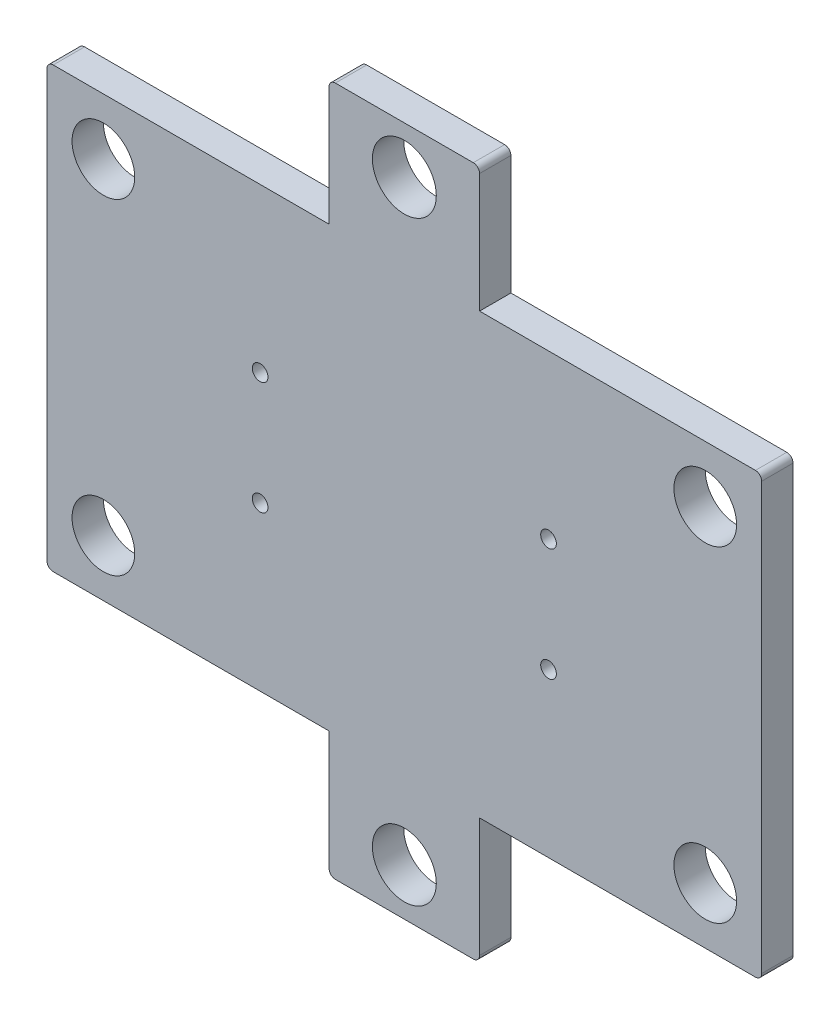
ISO-10303-21;
HEADER;
FILE_DESCRIPTION(('STEP AP214'),'2;1');
FILE_NAME('part.step','',(''),(''),'','','');
FILE_SCHEMA(('AUTOMOTIVE_DESIGN { 1 0 10303 214 1 1 1 1 }'));
ENDSEC;
DATA;
#1=APPLICATION_CONTEXT('core data for automotive mechanical design processes');
#2=APPLICATION_PROTOCOL_DEFINITION('international standard','automotive_design',2000,#1);
#3=PRODUCT_CONTEXT('',#1,'mechanical');
#4=PRODUCT('Part','Part','',(#3));
#5=PRODUCT_RELATED_PRODUCT_CATEGORY('part','',(#4));
#6=PRODUCT_DEFINITION_FORMATION('','',#4);
#7=PRODUCT_DEFINITION_CONTEXT('part definition',#1,'design');
#8=PRODUCT_DEFINITION('design','',#6,#7);
#9=PRODUCT_DEFINITION_SHAPE('','',#8);
#10=(LENGTH_UNIT() NAMED_UNIT(*) SI_UNIT(.MILLI.,.METRE.));
#11=(NAMED_UNIT(*) PLANE_ANGLE_UNIT() SI_UNIT($,.RADIAN.));
#12=(NAMED_UNIT(*) SI_UNIT($,.STERADIAN.) SOLID_ANGLE_UNIT());
#13=UNCERTAINTY_MEASURE_WITH_UNIT(LENGTH_MEASURE(1.E-05),#10,'distance_accuracy_value','');
#14=(GEOMETRIC_REPRESENTATION_CONTEXT(3) GLOBAL_UNCERTAINTY_ASSIGNED_CONTEXT((#13)) GLOBAL_UNIT_ASSIGNED_CONTEXT((#10,
#11,#12)) REPRESENTATION_CONTEXT('',''));
#15=CARTESIAN_POINT('',(0.,0.,0.));
#16=DIRECTION('',(0.,0.,1.));
#17=DIRECTION('',(1.,0.,0.));
#18=AXIS2_PLACEMENT_3D('',#15,#16,#17);
#19=CARTESIAN_POINT('',(0.,0.,5.));
#20=DIRECTION('',(0.,0.,1.));
#21=DIRECTION('',(1.,0.,0.));
#22=AXIS2_PLACEMENT_3D('',#19,#20,#21);
#23=PLANE('',#22);
#24=CARTESIAN_POINT('',(0.,-47.5,5.));
#25=DIRECTION('',(0.,0.,1.));
#26=DIRECTION('',(1.,0.,0.));
#27=AXIS2_PLACEMENT_3D('',#24,#25,#26);
#28=CIRCLE('',#27,5.1);
#29=CARTESIAN_POINT('',(5.1,-47.5,5.));
#30=VERTEX_POINT('',#29);
#31=EDGE_CURVE('E440',#30,#30,#28,.T.);
#32=ORIENTED_EDGE('',*,*,#31,.F.);
#33=EDGE_LOOP('',(#32));
#34=FACE_BOUND('',#33,.T.);
#35=CARTESIAN_POINT('',(0.,47.5,5.));
#36=DIRECTION('',(0.,0.,1.));
#37=DIRECTION('',(1.,0.,0.));
#38=AXIS2_PLACEMENT_3D('',#35,#36,#37);
#39=CIRCLE('',#38,5.1);
#40=CARTESIAN_POINT('',(5.1,47.5,5.));
#41=VERTEX_POINT('',#40);
#42=EDGE_CURVE('E434',#41,#41,#39,.T.);
#43=ORIENTED_EDGE('',*,*,#42,.F.);
#44=EDGE_LOOP('',(#43));
#45=FACE_BOUND('',#44,.T.);
#46=CARTESIAN_POINT('',(47.9999999999998,26.,5.));
#47=DIRECTION('',(0.,0.,-1.));
#48=DIRECTION('',(-1.,0.,0.));
#49=AXIS2_PLACEMENT_3D('',#46,#47,#48);
#50=CIRCLE('',#49,5.);
#51=CARTESIAN_POINT('',(42.9999999999998,26.,5.));
#52=VERTEX_POINT('',#51);
#53=EDGE_CURVE('E420',#52,#52,#50,.T.);
#54=ORIENTED_EDGE('',*,*,#53,.T.);
#55=EDGE_LOOP('',(#54));
#56=FACE_BOUND('',#55,.T.);
#57=CARTESIAN_POINT('',(-47.9999999999998,-26.,5.));
#58=DIRECTION('',(0.,0.,1.));
#59=DIRECTION('',(1.,0.,0.));
#60=AXIS2_PLACEMENT_3D('',#57,#58,#59);
#61=CIRCLE('',#60,5.);
#62=CARTESIAN_POINT('',(-42.9999999999998,-26.,5.));
#63=VERTEX_POINT('',#62);
#64=EDGE_CURVE('E414',#63,#63,#61,.T.);
#65=ORIENTED_EDGE('',*,*,#64,.F.);
#66=EDGE_LOOP('',(#65));
#67=FACE_BOUND('',#66,.T.);
#68=CARTESIAN_POINT('',(-47.9999999999998,26.,5.));
#69=DIRECTION('',(0.,0.,1.));
#70=DIRECTION('',(1.,0.,0.));
#71=AXIS2_PLACEMENT_3D('',#68,#69,#70);
#72=CIRCLE('',#71,5.);
#73=CARTESIAN_POINT('',(-42.9999999999998,26.,5.));
#74=VERTEX_POINT('',#73);
#75=EDGE_CURVE('E408',#74,#74,#72,.T.);
#76=ORIENTED_EDGE('',*,*,#75,.F.);
#77=EDGE_LOOP('',(#76));
#78=FACE_BOUND('',#77,.T.);
#79=CARTESIAN_POINT('',(23.,9.00000000000001,5.));
#80=DIRECTION('',(0.,0.,1.));
#81=DIRECTION('',(1.,0.,0.));
#82=AXIS2_PLACEMENT_3D('',#79,#80,#81);
#83=CIRCLE('',#82,1.24999999999999);
#84=CARTESIAN_POINT('',(24.25,9.00000000000001,5.));
#85=VERTEX_POINT('',#84);
#86=EDGE_CURVE('E404',#85,#85,#83,.T.);
#87=ORIENTED_EDGE('',*,*,#86,.F.);
#88=EDGE_LOOP('',(#87));
#89=FACE_BOUND('',#88,.T.);
#90=CARTESIAN_POINT('',(23.,-8.99999999999999,5.));
#91=DIRECTION('',(0.,0.,1.));
#92=DIRECTION('',(1.,0.,0.));
#93=AXIS2_PLACEMENT_3D('',#90,#91,#92);
#94=CIRCLE('',#93,1.24999999999999);
#95=CARTESIAN_POINT('',(24.25,-8.99999999999999,5.));
#96=VERTEX_POINT('',#95);
#97=EDGE_CURVE('E398',#96,#96,#94,.T.);
#98=ORIENTED_EDGE('',*,*,#97,.F.);
#99=EDGE_LOOP('',(#98));
#100=FACE_BOUND('',#99,.T.);
#101=CARTESIAN_POINT('',(-23.,9.00000000000001,5.));
#102=DIRECTION('',(0.,0.,1.));
#103=DIRECTION('',(1.,0.,0.));
#104=AXIS2_PLACEMENT_3D('',#101,#102,#103);
#105=CIRCLE('',#104,1.24999999999999);
#106=CARTESIAN_POINT('',(-21.75,9.00000000000001,5.));
#107=VERTEX_POINT('',#106);
#108=EDGE_CURVE('E392',#107,#107,#105,.T.);
#109=ORIENTED_EDGE('',*,*,#108,.F.);
#110=EDGE_LOOP('',(#109));
#111=FACE_BOUND('',#110,.T.);
#112=CARTESIAN_POINT('',(-23.,-8.99999999999999,5.));
#113=DIRECTION('',(0.,0.,1.));
#114=DIRECTION('',(1.,0.,0.));
#115=AXIS2_PLACEMENT_3D('',#112,#113,#114);
#116=CIRCLE('',#115,1.24999999999999);
#117=CARTESIAN_POINT('',(-21.75,-8.99999999999999,5.));
#118=VERTEX_POINT('',#117);
#119=EDGE_CURVE('E386',#118,#118,#116,.T.);
#120=ORIENTED_EDGE('',*,*,#119,.F.);
#121=EDGE_LOOP('',(#120));
#122=FACE_BOUND('',#121,.T.);
#123=DIRECTION('',(0.,1.,0.));
#124=VECTOR('',#123,1.);
#125=CARTESIAN_POINT('',(12.0000000000002,35.,5.));
#126=LINE('',#125,#124);
#127=CARTESIAN_POINT('',(12.0000000000002,35.,5.));
#128=VERTEX_POINT('',#127);
#129=CARTESIAN_POINT('',(12.0000000000002,54.,5.));
#130=VERTEX_POINT('',#129);
#131=EDGE_CURVE('E215',#128,#130,#126,.T.);
#132=ORIENTED_EDGE('',*,*,#131,.T.);
#133=CARTESIAN_POINT('',(11.0000000000002,54.,5.));
#134=DIRECTION('',(0.,0.,1.));
#135=DIRECTION('',(1.,0.,0.));
#136=AXIS2_PLACEMENT_3D('',#133,#134,#135);
#137=CIRCLE('',#136,1.);
#138=CARTESIAN_POINT('',(11.0000000000002,55.,5.));
#139=VERTEX_POINT('',#138);
#140=EDGE_CURVE('E294',#130,#139,#137,.T.);
#141=ORIENTED_EDGE('',*,*,#140,.T.);
#142=DIRECTION('',(-1.,0.,0.));
#143=VECTOR('',#142,1.);
#144=CARTESIAN_POINT('',(12.0000000000002,55.,5.));
#145=LINE('',#144,#143);
#146=CARTESIAN_POINT('',(-10.9999999999998,55.,5.));
#147=VERTEX_POINT('',#146);
#148=EDGE_CURVE('E217',#139,#147,#145,.T.);
#149=ORIENTED_EDGE('',*,*,#148,.T.);
#150=CARTESIAN_POINT('',(-10.9999999999998,54.,5.));
#151=DIRECTION('',(0.,0.,1.));
#152=DIRECTION('',(1.,0.,0.));
#153=AXIS2_PLACEMENT_3D('',#150,#151,#152);
#154=CIRCLE('',#153,1.);
#155=CARTESIAN_POINT('',(-11.9999999999998,54.,5.));
#156=VERTEX_POINT('',#155);
#157=EDGE_CURVE('E49',#147,#156,#154,.T.);
#158=ORIENTED_EDGE('',*,*,#157,.T.);
#159=DIRECTION('',(0.,-1.,0.));
#160=VECTOR('',#159,1.);
#161=CARTESIAN_POINT('',(-11.9999999999998,55.,5.));
#162=LINE('',#161,#160);
#163=CARTESIAN_POINT('',(-11.9999999999998,35.,5.));
#164=VERTEX_POINT('',#163);
#165=EDGE_CURVE('E219',#156,#164,#162,.T.);
#166=ORIENTED_EDGE('',*,*,#165,.T.);
#167=DIRECTION('',(-1.,0.,0.));
#168=VECTOR('',#167,1.);
#169=CARTESIAN_POINT('',(-11.9999999999998,35.,5.));
#170=LINE('',#169,#168);
#171=CARTESIAN_POINT('',(-55.9999999999998,35.,5.));
#172=VERTEX_POINT('',#171);
#173=EDGE_CURVE('E253',#164,#172,#170,.T.);
#174=ORIENTED_EDGE('',*,*,#173,.T.);
#175=CARTESIAN_POINT('',(-55.9999999999998,34.,5.));
#176=DIRECTION('',(0.,0.,1.));
#177=DIRECTION('',(1.,0.,0.));
#178=AXIS2_PLACEMENT_3D('',#175,#176,#177);
#179=CIRCLE('',#178,1.);
#180=CARTESIAN_POINT('',(-56.9999999999998,34.,5.));
#181=VERTEX_POINT('',#180);
#182=EDGE_CURVE('E287',#172,#181,#179,.T.);
#183=ORIENTED_EDGE('',*,*,#182,.T.);
#184=DIRECTION('',(0.,-1.,0.));
#185=VECTOR('',#184,1.);
#186=CARTESIAN_POINT('',(-56.9999999999998,35.,5.));
#187=LINE('',#186,#185);
#188=CARTESIAN_POINT('',(-56.9999999999998,-34.,5.));
#189=VERTEX_POINT('',#188);
#190=EDGE_CURVE('E184',#181,#189,#187,.T.);
#191=ORIENTED_EDGE('',*,*,#190,.T.);
#192=CARTESIAN_POINT('',(-55.9999999999998,-34.,5.));
#193=DIRECTION('',(0.,0.,1.));
#194=DIRECTION('',(1.,0.,0.));
#195=AXIS2_PLACEMENT_3D('',#192,#193,#194);
#196=CIRCLE('',#195,1.);
#197=CARTESIAN_POINT('',(-55.9999999999998,-35.,5.));
#198=VERTEX_POINT('',#197);
#199=EDGE_CURVE('E180',#189,#198,#196,.T.);
#200=ORIENTED_EDGE('',*,*,#199,.T.);
#201=DIRECTION('',(1.,0.,0.));
#202=VECTOR('',#201,1.);
#203=CARTESIAN_POINT('',(-56.9999999999998,-35.,5.));
#204=LINE('',#203,#202);
#205=CARTESIAN_POINT('',(-11.9999999999998,-35.,5.));
#206=VERTEX_POINT('',#205);
#207=EDGE_CURVE('E171',#198,#206,#204,.T.);
#208=ORIENTED_EDGE('',*,*,#207,.T.);
#209=DIRECTION('',(0.,-1.,0.));
#210=VECTOR('',#209,1.);
#211=CARTESIAN_POINT('',(-11.9999999999998,-35.,5.));
#212=LINE('',#211,#210);
#213=CARTESIAN_POINT('',(-11.9999999999998,-54.,5.));
#214=VERTEX_POINT('',#213);
#215=EDGE_CURVE('E176',#206,#214,#212,.T.);
#216=ORIENTED_EDGE('',*,*,#215,.T.);
#217=CARTESIAN_POINT('',(-10.9999999999998,-54.,5.));
#218=DIRECTION('',(0.,0.,1.));
#219=DIRECTION('',(1.,0.,0.));
#220=AXIS2_PLACEMENT_3D('',#217,#218,#219);
#221=CIRCLE('',#220,1.);
#222=CARTESIAN_POINT('',(-10.9999999999998,-55.,5.));
#223=VERTEX_POINT('',#222);
#224=EDGE_CURVE('E289',#214,#223,#221,.T.);
#225=ORIENTED_EDGE('',*,*,#224,.T.);
#226=DIRECTION('',(1.,0.,0.));
#227=VECTOR('',#226,1.);
#228=CARTESIAN_POINT('',(-11.9999999999998,-55.,5.));
#229=LINE('',#228,#227);
#230=CARTESIAN_POINT('',(11.0000000000002,-55.,5.));
#231=VERTEX_POINT('',#230);
#232=EDGE_CURVE('E200',#223,#231,#229,.T.);
#233=ORIENTED_EDGE('',*,*,#232,.T.);
#234=CARTESIAN_POINT('',(11.0000000000002,-54.,5.));
#235=DIRECTION('',(0.,0.,1.));
#236=DIRECTION('',(1.,0.,0.));
#237=AXIS2_PLACEMENT_3D('',#234,#235,#236);
#238=CIRCLE('',#237,1.);
#239=CARTESIAN_POINT('',(12.0000000000002,-54.,5.));
#240=VERTEX_POINT('',#239);
#241=EDGE_CURVE('E291',#231,#240,#238,.T.);
#242=ORIENTED_EDGE('',*,*,#241,.T.);
#243=DIRECTION('',(0.,1.,0.));
#244=VECTOR('',#243,1.);
#245=CARTESIAN_POINT('',(12.0000000000002,-55.,5.));
#246=LINE('',#245,#244);
#247=CARTESIAN_POINT('',(12.0000000000002,-35.,5.));
#248=VERTEX_POINT('',#247);
#249=EDGE_CURVE('E203',#240,#248,#246,.T.);
#250=ORIENTED_EDGE('',*,*,#249,.T.);
#251=DIRECTION('',(1.,0.,0.));
#252=VECTOR('',#251,1.);
#253=CARTESIAN_POINT('',(12.0000000000002,-35.,5.));
#254=LINE('',#253,#252);
#255=CARTESIAN_POINT('',(56.0000000000002,-35.,5.));
#256=VERTEX_POINT('',#255);
#257=EDGE_CURVE('E208',#248,#256,#254,.T.);
#258=ORIENTED_EDGE('',*,*,#257,.T.);
#259=CARTESIAN_POINT('',(56.0000000000002,-34.,5.));
#260=DIRECTION('',(0.,0.,1.));
#261=DIRECTION('',(1.,0.,0.));
#262=AXIS2_PLACEMENT_3D('',#259,#260,#261);
#263=CIRCLE('',#262,1.);
#264=CARTESIAN_POINT('',(57.0000000000002,-34.,5.));
#265=VERTEX_POINT('',#264);
#266=EDGE_CURVE('E284',#256,#265,#263,.T.);
#267=ORIENTED_EDGE('',*,*,#266,.T.);
#268=DIRECTION('',(0.,1.,0.));
#269=VECTOR('',#268,1.);
#270=CARTESIAN_POINT('',(57.0000000000002,-35.,5.));
#271=LINE('',#270,#269);
#272=CARTESIAN_POINT('',(57.0000000000002,34.,5.));
#273=VERTEX_POINT('',#272);
#274=EDGE_CURVE('E211',#265,#273,#271,.T.);
#275=ORIENTED_EDGE('',*,*,#274,.T.);
#276=CARTESIAN_POINT('',(56.0000000000002,34.,5.));
#277=DIRECTION('',(0.,0.,1.));
#278=DIRECTION('',(1.,0.,0.));
#279=AXIS2_PLACEMENT_3D('',#276,#277,#278);
#280=CIRCLE('',#279,1.);
#281=CARTESIAN_POINT('',(56.0000000000002,35.,5.));
#282=VERTEX_POINT('',#281);
#283=EDGE_CURVE('E56',#273,#282,#280,.T.);
#284=ORIENTED_EDGE('',*,*,#283,.T.);
#285=DIRECTION('',(-1.,0.,0.));
#286=VECTOR('',#285,1.);
#287=CARTESIAN_POINT('',(57.0000000000002,35.,5.));
#288=LINE('',#287,#286);
#289=EDGE_CURVE('E213',#282,#128,#288,.T.);
#290=ORIENTED_EDGE('',*,*,#289,.T.);
#291=EDGE_LOOP('',(#132,#141,#149,#158,#166,#174,#183,#191,#200,#208,#216,#225,#233,#242,#250,
#258,#267,#275,#284,#290));
#292=FACE_BOUND('',#291,.T.);
#293=CARTESIAN_POINT('',(47.9999999999998,-26.,5.));
#294=DIRECTION('',(0.,0.,-1.));
#295=DIRECTION('',(-1.,0.,0.));
#296=AXIS2_PLACEMENT_3D('',#293,#294,#295);
#297=CIRCLE('',#296,5.);
#298=CARTESIAN_POINT('',(42.9999999999998,-26.,5.));
#299=VERTEX_POINT('',#298);
#300=EDGE_CURVE('E426',#299,#299,#297,.T.);
#301=ORIENTED_EDGE('',*,*,#300,.T.);
#302=EDGE_LOOP('',(#301));
#303=FACE_BOUND('',#302,.T.);
#304=ADVANCED_FACE('F34',(#34,#45,#56,#67,#78,#89,#100,#111,#122,#292,#303),#23,.T.);
#305=CARTESIAN_POINT('',(0.,0.,0.));
#306=DIRECTION('',(0.,0.,1.));
#307=DIRECTION('',(1.,0.,0.));
#308=AXIS2_PLACEMENT_3D('',#305,#306,#307);
#309=PLANE('',#308);
#310=CARTESIAN_POINT('',(0.,-47.5,0.));
#311=DIRECTION('',(0.,0.,1.));
#312=DIRECTION('',(1.,0.,0.));
#313=AXIS2_PLACEMENT_3D('',#310,#311,#312);
#314=CIRCLE('',#313,5.1);
#315=CARTESIAN_POINT('',(5.1,-47.5,0.));
#316=VERTEX_POINT('',#315);
#317=EDGE_CURVE('E437',#316,#316,#314,.T.);
#318=ORIENTED_EDGE('',*,*,#317,.T.);
#319=EDGE_LOOP('',(#318));
#320=FACE_BOUND('',#319,.T.);
#321=CARTESIAN_POINT('',(0.,47.5,0.));
#322=DIRECTION('',(0.,0.,1.));
#323=DIRECTION('',(1.,0.,0.));
#324=AXIS2_PLACEMENT_3D('',#321,#322,#323);
#325=CIRCLE('',#324,5.1);
#326=CARTESIAN_POINT('',(5.1,47.5,0.));
#327=VERTEX_POINT('',#326);
#328=EDGE_CURVE('E429',#327,#327,#325,.T.);
#329=ORIENTED_EDGE('',*,*,#328,.T.);
#330=EDGE_LOOP('',(#329));
#331=FACE_BOUND('',#330,.T.);
#332=CARTESIAN_POINT('',(47.9999999999998,26.,0.));
#333=DIRECTION('',(0.,0.,-1.));
#334=DIRECTION('',(-1.,0.,0.));
#335=AXIS2_PLACEMENT_3D('',#332,#333,#334);
#336=CIRCLE('',#335,5.);
#337=CARTESIAN_POINT('',(42.9999999999998,26.,0.));
#338=VERTEX_POINT('',#337);
#339=EDGE_CURVE('E417',#338,#338,#336,.T.);
#340=ORIENTED_EDGE('',*,*,#339,.F.);
#341=EDGE_LOOP('',(#340));
#342=FACE_BOUND('',#341,.T.);
#343=CARTESIAN_POINT('',(-47.9999999999998,-26.,0.));
#344=DIRECTION('',(0.,0.,1.));
#345=DIRECTION('',(1.,0.,0.));
#346=AXIS2_PLACEMENT_3D('',#343,#344,#345);
#347=CIRCLE('',#346,5.);
#348=CARTESIAN_POINT('',(-42.9999999999998,-26.,0.));
#349=VERTEX_POINT('',#348);
#350=EDGE_CURVE('E411',#349,#349,#347,.T.);
#351=ORIENTED_EDGE('',*,*,#350,.T.);
#352=EDGE_LOOP('',(#351));
#353=FACE_BOUND('',#352,.T.);
#354=CARTESIAN_POINT('',(-47.9999999999998,26.,0.));
#355=DIRECTION('',(0.,0.,1.));
#356=DIRECTION('',(1.,0.,0.));
#357=AXIS2_PLACEMENT_3D('',#354,#355,#356);
#358=CIRCLE('',#357,5.);
#359=CARTESIAN_POINT('',(-42.9999999999998,26.,0.));
#360=VERTEX_POINT('',#359);
#361=EDGE_CURVE('E407',#360,#360,#358,.T.);
#362=ORIENTED_EDGE('',*,*,#361,.T.);
#363=EDGE_LOOP('',(#362));
#364=FACE_BOUND('',#363,.T.);
#365=CARTESIAN_POINT('',(23.,9.00000000000001,0.));
#366=DIRECTION('',(0.,0.,1.));
#367=DIRECTION('',(1.,0.,0.));
#368=AXIS2_PLACEMENT_3D('',#365,#366,#367);
#369=CIRCLE('',#368,1.25);
#370=CARTESIAN_POINT('',(24.25,9.00000000000001,0.));
#371=VERTEX_POINT('',#370);
#372=EDGE_CURVE('E401',#371,#371,#369,.T.);
#373=ORIENTED_EDGE('',*,*,#372,.T.);
#374=EDGE_LOOP('',(#373));
#375=FACE_BOUND('',#374,.T.);
#376=CARTESIAN_POINT('',(23.,-8.99999999999999,0.));
#377=DIRECTION('',(0.,0.,1.));
#378=DIRECTION('',(1.,0.,0.));
#379=AXIS2_PLACEMENT_3D('',#376,#377,#378);
#380=CIRCLE('',#379,1.25);
#381=CARTESIAN_POINT('',(24.25,-8.99999999999999,0.));
#382=VERTEX_POINT('',#381);
#383=EDGE_CURVE('E395',#382,#382,#380,.T.);
#384=ORIENTED_EDGE('',*,*,#383,.T.);
#385=EDGE_LOOP('',(#384));
#386=FACE_BOUND('',#385,.T.);
#387=CARTESIAN_POINT('',(-23.,9.00000000000001,0.));
#388=DIRECTION('',(0.,0.,1.));
#389=DIRECTION('',(1.,0.,0.));
#390=AXIS2_PLACEMENT_3D('',#387,#388,#389);
#391=CIRCLE('',#390,1.25);
#392=CARTESIAN_POINT('',(-21.75,9.00000000000001,0.));
#393=VERTEX_POINT('',#392);
#394=EDGE_CURVE('E389',#393,#393,#391,.T.);
#395=ORIENTED_EDGE('',*,*,#394,.T.);
#396=EDGE_LOOP('',(#395));
#397=FACE_BOUND('',#396,.T.);
#398=CARTESIAN_POINT('',(-23.,-8.99999999999999,0.));
#399=DIRECTION('',(0.,0.,1.));
#400=DIRECTION('',(1.,0.,0.));
#401=AXIS2_PLACEMENT_3D('',#398,#399,#400);
#402=CIRCLE('',#401,1.25);
#403=CARTESIAN_POINT('',(-21.75,-8.99999999999999,0.));
#404=VERTEX_POINT('',#403);
#405=EDGE_CURVE('E226',#404,#404,#402,.T.);
#406=ORIENTED_EDGE('',*,*,#405,.T.);
#407=EDGE_LOOP('',(#406));
#408=FACE_BOUND('',#407,.T.);
#409=DIRECTION('',(-1.,0.,0.));
#410=VECTOR('',#409,1.);
#411=CARTESIAN_POINT('',(12.0000000000002,55.,0.));
#412=LINE('',#411,#410);
#413=CARTESIAN_POINT('',(11.0000000000002,55.,0.));
#414=VERTEX_POINT('',#413);
#415=CARTESIAN_POINT('',(-10.9999999999998,55.,0.));
#416=VERTEX_POINT('',#415);
#417=EDGE_CURVE('E248',#414,#416,#412,.T.);
#418=ORIENTED_EDGE('',*,*,#417,.F.);
#419=CARTESIAN_POINT('',(11.0000000000002,54.,0.));
#420=DIRECTION('',(0.,0.,1.));
#421=DIRECTION('',(1.,0.,0.));
#422=AXIS2_PLACEMENT_3D('',#419,#420,#421);
#423=CIRCLE('',#422,1.);
#424=CARTESIAN_POINT('',(12.0000000000002,54.,0.));
#425=VERTEX_POINT('',#424);
#426=EDGE_CURVE('E279',#414,#425,#423,.F.);
#427=ORIENTED_EDGE('',*,*,#426,.T.);
#428=DIRECTION('',(0.,1.,0.));
#429=VECTOR('',#428,1.);
#430=CARTESIAN_POINT('',(12.0000000000002,35.,0.));
#431=LINE('',#430,#429);
#432=CARTESIAN_POINT('',(12.0000000000002,35.,0.));
#433=VERTEX_POINT('',#432);
#434=EDGE_CURVE('E245',#433,#425,#431,.T.);
#435=ORIENTED_EDGE('',*,*,#434,.F.);
#436=DIRECTION('',(-1.,0.,0.));
#437=VECTOR('',#436,1.);
#438=CARTESIAN_POINT('',(57.0000000000002,35.,0.));
#439=LINE('',#438,#437);
#440=CARTESIAN_POINT('',(56.0000000000002,35.,0.));
#441=VERTEX_POINT('',#440);
#442=EDGE_CURVE('E243',#441,#433,#439,.T.);
#443=ORIENTED_EDGE('',*,*,#442,.F.);
#444=CARTESIAN_POINT('',(56.0000000000002,34.,0.));
#445=DIRECTION('',(0.,0.,1.));
#446=DIRECTION('',(1.,0.,0.));
#447=AXIS2_PLACEMENT_3D('',#444,#445,#446);
#448=CIRCLE('',#447,1.);
#449=CARTESIAN_POINT('',(57.0000000000002,34.,0.));
#450=VERTEX_POINT('',#449);
#451=EDGE_CURVE('E265',#441,#450,#448,.F.);
#452=ORIENTED_EDGE('',*,*,#451,.T.);
#453=DIRECTION('',(0.,1.,0.));
#454=VECTOR('',#453,1.);
#455=CARTESIAN_POINT('',(57.0000000000002,-35.,0.));
#456=LINE('',#455,#454);
#457=CARTESIAN_POINT('',(57.0000000000002,-34.,0.));
#458=VERTEX_POINT('',#457);
#459=EDGE_CURVE('E240',#458,#450,#456,.T.);
#460=ORIENTED_EDGE('',*,*,#459,.F.);
#461=CARTESIAN_POINT('',(56.0000000000002,-34.,0.));
#462=DIRECTION('',(0.,0.,1.));
#463=DIRECTION('',(1.,0.,0.));
#464=AXIS2_PLACEMENT_3D('',#461,#462,#463);
#465=CIRCLE('',#464,1.);
#466=CARTESIAN_POINT('',(56.0000000000002,-35.,0.));
#467=VERTEX_POINT('',#466);
#468=EDGE_CURVE('E267',#458,#467,#465,.F.);
#469=ORIENTED_EDGE('',*,*,#468,.T.);
#470=DIRECTION('',(1.,0.,0.));
#471=VECTOR('',#470,1.);
#472=CARTESIAN_POINT('',(12.0000000000002,-35.,0.));
#473=LINE('',#472,#471);
#474=CARTESIAN_POINT('',(12.0000000000002,-35.,0.));
#475=VERTEX_POINT('',#474);
#476=EDGE_CURVE('E237',#475,#467,#473,.T.);
#477=ORIENTED_EDGE('',*,*,#476,.F.);
#478=DIRECTION('',(0.,1.,0.));
#479=VECTOR('',#478,1.);
#480=CARTESIAN_POINT('',(12.0000000000002,-55.,0.));
#481=LINE('',#480,#479);
#482=CARTESIAN_POINT('',(12.0000000000002,-54.,0.));
#483=VERTEX_POINT('',#482);
#484=EDGE_CURVE('E235',#483,#475,#481,.T.);
#485=ORIENTED_EDGE('',*,*,#484,.F.);
#486=CARTESIAN_POINT('',(11.0000000000002,-54.,0.));
#487=DIRECTION('',(0.,0.,1.));
#488=DIRECTION('',(1.,0.,0.));
#489=AXIS2_PLACEMENT_3D('',#486,#487,#488);
#490=CIRCLE('',#489,1.);
#491=CARTESIAN_POINT('',(11.0000000000002,-55.,0.));
#492=VERTEX_POINT('',#491);
#493=EDGE_CURVE('E275',#483,#492,#490,.F.);
#494=ORIENTED_EDGE('',*,*,#493,.T.);
#495=DIRECTION('',(1.,0.,0.));
#496=VECTOR('',#495,1.);
#497=CARTESIAN_POINT('',(-11.9999999999998,-55.,0.));
#498=LINE('',#497,#496);
#499=CARTESIAN_POINT('',(-10.9999999999998,-55.,0.));
#500=VERTEX_POINT('',#499);
#501=EDGE_CURVE('E232',#500,#492,#498,.T.);
#502=ORIENTED_EDGE('',*,*,#501,.F.);
#503=CARTESIAN_POINT('',(-10.9999999999998,-54.,0.));
#504=DIRECTION('',(0.,0.,1.));
#505=DIRECTION('',(1.,0.,0.));
#506=AXIS2_PLACEMENT_3D('',#503,#504,#505);
#507=CIRCLE('',#506,1.);
#508=CARTESIAN_POINT('',(-11.9999999999998,-54.,0.));
#509=VERTEX_POINT('',#508);
#510=EDGE_CURVE('E273',#500,#509,#507,.F.);
#511=ORIENTED_EDGE('',*,*,#510,.T.);
#512=DIRECTION('',(0.,-1.,0.));
#513=VECTOR('',#512,1.);
#514=CARTESIAN_POINT('',(-11.9999999999998,-35.,0.));
#515=LINE('',#514,#513);
#516=CARTESIAN_POINT('',(-11.9999999999998,-35.,0.));
#517=VERTEX_POINT('',#516);
#518=EDGE_CURVE('E230',#517,#509,#515,.T.);
#519=ORIENTED_EDGE('',*,*,#518,.F.);
#520=DIRECTION('',(1.,0.,0.));
#521=VECTOR('',#520,1.);
#522=CARTESIAN_POINT('',(-56.9999999999998,-35.,0.));
#523=LINE('',#522,#521);
#524=CARTESIAN_POINT('',(-55.9999999999998,-35.,0.));
#525=VERTEX_POINT('',#524);
#526=EDGE_CURVE('E190',#525,#517,#523,.T.);
#527=ORIENTED_EDGE('',*,*,#526,.F.);
#528=CARTESIAN_POINT('',(-55.9999999999998,-34.,0.));
#529=DIRECTION('',(0.,0.,1.));
#530=DIRECTION('',(1.,0.,0.));
#531=AXIS2_PLACEMENT_3D('',#528,#529,#530);
#532=CIRCLE('',#531,1.);
#533=CARTESIAN_POINT('',(-56.9999999999998,-34.,0.));
#534=VERTEX_POINT('',#533);
#535=EDGE_CURVE('E269',#525,#534,#532,.F.);
#536=ORIENTED_EDGE('',*,*,#535,.T.);
#537=DIRECTION('',(0.,-1.,0.));
#538=VECTOR('',#537,1.);
#539=CARTESIAN_POINT('',(-56.9999999999998,35.,0.));
#540=LINE('',#539,#538);
#541=CARTESIAN_POINT('',(-56.9999999999998,34.,0.));
#542=VERTEX_POINT('',#541);
#543=EDGE_CURVE('E225',#542,#534,#540,.T.);
#544=ORIENTED_EDGE('',*,*,#543,.F.);
#545=CARTESIAN_POINT('',(-55.9999999999998,34.,0.));
#546=DIRECTION('',(0.,0.,1.));
#547=DIRECTION('',(1.,0.,0.));
#548=AXIS2_PLACEMENT_3D('',#545,#546,#547);
#549=CIRCLE('',#548,1.);
#550=CARTESIAN_POINT('',(-55.9999999999998,35.,0.));
#551=VERTEX_POINT('',#550);
#552=EDGE_CURVE('E271',#542,#551,#549,.F.);
#553=ORIENTED_EDGE('',*,*,#552,.T.);
#554=DIRECTION('',(-1.,0.,0.));
#555=VECTOR('',#554,1.);
#556=CARTESIAN_POINT('',(-11.9999999999998,35.,0.));
#557=LINE('',#556,#555);
#558=CARTESIAN_POINT('',(-11.9999999999998,35.,0.));
#559=VERTEX_POINT('',#558);
#560=EDGE_CURVE('E222',#559,#551,#557,.T.);
#561=ORIENTED_EDGE('',*,*,#560,.F.);
#562=DIRECTION('',(0.,-1.,0.));
#563=VECTOR('',#562,1.);
#564=CARTESIAN_POINT('',(-11.9999999999998,55.,0.));
#565=LINE('',#564,#563);
#566=CARTESIAN_POINT('',(-11.9999999999998,54.,0.));
#567=VERTEX_POINT('',#566);
#568=EDGE_CURVE('E251',#567,#559,#565,.T.);
#569=ORIENTED_EDGE('',*,*,#568,.F.);
#570=CARTESIAN_POINT('',(-10.9999999999998,54.,0.));
#571=DIRECTION('',(0.,0.,1.));
#572=DIRECTION('',(1.,0.,0.));
#573=AXIS2_PLACEMENT_3D('',#570,#571,#572);
#574=CIRCLE('',#573,1.);
#575=EDGE_CURVE('E277',#567,#416,#574,.F.);
#576=ORIENTED_EDGE('',*,*,#575,.T.);
#577=EDGE_LOOP('',(#418,#427,#435,#443,#452,#460,#469,#477,#485,#494,#502,#511,#519,#527,#536,
#544,#553,#561,#569,#576));
#578=FACE_BOUND('',#577,.T.);
#579=CARTESIAN_POINT('',(47.9999999999998,-26.,0.));
#580=DIRECTION('',(0.,0.,-1.));
#581=DIRECTION('',(-1.,0.,0.));
#582=AXIS2_PLACEMENT_3D('',#579,#580,#581);
#583=CIRCLE('',#582,5.);
#584=CARTESIAN_POINT('',(42.9999999999998,-26.,0.));
#585=VERTEX_POINT('',#584);
#586=EDGE_CURVE('E423',#585,#585,#583,.T.);
#587=ORIENTED_EDGE('',*,*,#586,.F.);
#588=EDGE_LOOP('',(#587));
#589=FACE_BOUND('',#588,.T.);
#590=ADVANCED_FACE('F339',(#320,#331,#342,#353,#364,#375,#386,#397,#408,#578,#589),#309,.F.);
#591=CARTESIAN_POINT('',(-11.9999999999998,35.,5.));
#592=DIRECTION('',(0.,-1.,0.));
#593=DIRECTION('',(1.,0.,0.));
#594=AXIS2_PLACEMENT_3D('',#591,#592,#593);
#595=PLANE('',#594);
#596=ORIENTED_EDGE('',*,*,#560,.T.);
#597=DIRECTION('',(0.,0.,-1.));
#598=VECTOR('',#597,1.);
#599=CARTESIAN_POINT('',(-55.9999999999998,35.,5.));
#600=LINE('',#599,#598);
#601=EDGE_CURVE('E313',#551,#172,#600,.F.);
#602=ORIENTED_EDGE('',*,*,#601,.T.);
#603=ORIENTED_EDGE('',*,*,#173,.F.);
#604=DIRECTION('',(0.,0.,-1.));
#605=VECTOR('',#604,1.);
#606=CARTESIAN_POINT('',(-11.9999999999998,35.,5.));
#607=LINE('',#606,#605);
#608=EDGE_CURVE('E221',#164,#559,#607,.T.);
#609=ORIENTED_EDGE('',*,*,#608,.T.);
#610=EDGE_LOOP('',(#596,#602,#603,#609));
#611=FACE_BOUND('',#610,.T.);
#612=ADVANCED_FACE('F482',(#611),#595,.F.);
#613=CARTESIAN_POINT('',(-56.9999999999998,35.,5.));
#614=DIRECTION('',(1.,0.,0.));
#615=DIRECTION('',(0.,0.,-1.));
#616=AXIS2_PLACEMENT_3D('',#613,#614,#615);
#617=PLANE('',#616);
#618=ORIENTED_EDGE('',*,*,#190,.F.);
#619=DIRECTION('',(0.,0.,-1.));
#620=VECTOR('',#619,1.);
#621=CARTESIAN_POINT('',(-56.9999999999998,34.,5.));
#622=LINE('',#621,#620);
#623=EDGE_CURVE('E310',#181,#542,#622,.T.);
#624=ORIENTED_EDGE('',*,*,#623,.T.);
#625=ORIENTED_EDGE('',*,*,#543,.T.);
#626=DIRECTION('',(0.,0.,-1.));
#627=VECTOR('',#626,1.);
#628=CARTESIAN_POINT('',(-56.9999999999998,-34.,5.));
#629=LINE('',#628,#627);
#630=EDGE_CURVE('E308',#534,#189,#629,.F.);
#631=ORIENTED_EDGE('',*,*,#630,.T.);
#632=EDGE_LOOP('',(#618,#624,#625,#631));
#633=FACE_BOUND('',#632,.T.);
#634=ADVANCED_FACE('F379',(#633),#617,.F.);
#635=CARTESIAN_POINT('',(-56.9999999999998,-35.,5.));
#636=DIRECTION('',(0.,1.,0.));
#637=DIRECTION('',(0.,0.,1.));
#638=AXIS2_PLACEMENT_3D('',#635,#636,#637);
#639=PLANE('',#638);
#640=ORIENTED_EDGE('',*,*,#207,.F.);
#641=DIRECTION('',(0.,0.,-1.));
#642=VECTOR('',#641,1.);
#643=CARTESIAN_POINT('',(-55.9999999999998,-35.,5.));
#644=LINE('',#643,#642);
#645=EDGE_CURVE('E315',#198,#525,#644,.T.);
#646=ORIENTED_EDGE('',*,*,#645,.T.);
#647=ORIENTED_EDGE('',*,*,#526,.T.);
#648=DIRECTION('',(0.,0.,-1.));
#649=VECTOR('',#648,1.);
#650=CARTESIAN_POINT('',(-11.9999999999998,-35.,5.));
#651=LINE('',#650,#649);
#652=EDGE_CURVE('E187',#206,#517,#651,.T.);
#653=ORIENTED_EDGE('',*,*,#652,.F.);
#654=EDGE_LOOP('',(#640,#646,#647,#653));
#655=FACE_BOUND('',#654,.T.);
#656=ADVANCED_FACE('F188',(#655),#639,.F.);
#657=CARTESIAN_POINT('',(-11.9999999999998,-35.,5.));
#658=DIRECTION('',(1.,0.,0.));
#659=DIRECTION('',(0.,1.,0.));
#660=AXIS2_PLACEMENT_3D('',#657,#658,#659);
#661=PLANE('',#660);
#662=ORIENTED_EDGE('',*,*,#518,.T.);
#663=DIRECTION('',(0.,0.,-1.));
#664=VECTOR('',#663,1.);
#665=CARTESIAN_POINT('',(-11.9999999999998,-54.,5.));
#666=LINE('',#665,#664);
#667=EDGE_CURVE('E199',#509,#214,#666,.F.);
#668=ORIENTED_EDGE('',*,*,#667,.T.);
#669=ORIENTED_EDGE('',*,*,#215,.F.);
#670=ORIENTED_EDGE('',*,*,#652,.T.);
#671=EDGE_LOOP('',(#662,#668,#669,#670));
#672=FACE_BOUND('',#671,.T.);
#673=ADVANCED_FACE('F197',(#672),#661,.F.);
#674=CARTESIAN_POINT('',(-11.9999999999998,-55.,5.));
#675=DIRECTION('',(0.,1.,0.));
#676=DIRECTION('',(0.,0.,1.));
#677=AXIS2_PLACEMENT_3D('',#674,#675,#676);
#678=PLANE('',#677);
#679=ORIENTED_EDGE('',*,*,#501,.T.);
#680=DIRECTION('',(0.,0.,-1.));
#681=VECTOR('',#680,1.);
#682=CARTESIAN_POINT('',(11.0000000000002,-55.,5.));
#683=LINE('',#682,#681);
#684=EDGE_CURVE('E305',#492,#231,#683,.F.);
#685=ORIENTED_EDGE('',*,*,#684,.T.);
#686=ORIENTED_EDGE('',*,*,#232,.F.);
#687=DIRECTION('',(0.,0.,-1.));
#688=VECTOR('',#687,1.);
#689=CARTESIAN_POINT('',(-10.9999999999998,-55.,5.));
#690=LINE('',#689,#688);
#691=EDGE_CURVE('E302',#223,#500,#690,.T.);
#692=ORIENTED_EDGE('',*,*,#691,.T.);
#693=EDGE_LOOP('',(#679,#685,#686,#692));
#694=FACE_BOUND('',#693,.T.);
#695=ADVANCED_FACE('F500',(#694),#678,.F.);
#696=CARTESIAN_POINT('',(12.0000000000002,-55.,5.));
#697=DIRECTION('',(-1.,0.,0.));
#698=DIRECTION('',(0.,0.,1.));
#699=AXIS2_PLACEMENT_3D('',#696,#697,#698);
#700=PLANE('',#699);
#701=ORIENTED_EDGE('',*,*,#249,.F.);
#702=DIRECTION('',(0.,0.,-1.));
#703=VECTOR('',#702,1.);
#704=CARTESIAN_POINT('',(12.0000000000002,-54.,5.));
#705=LINE('',#704,#703);
#706=EDGE_CURVE('E299',#240,#483,#705,.T.);
#707=ORIENTED_EDGE('',*,*,#706,.T.);
#708=ORIENTED_EDGE('',*,*,#484,.T.);
#709=DIRECTION('',(0.,0.,-1.));
#710=VECTOR('',#709,1.);
#711=CARTESIAN_POINT('',(12.0000000000002,-35.,5.));
#712=LINE('',#711,#710);
#713=EDGE_CURVE('E195',#248,#475,#712,.T.);
#714=ORIENTED_EDGE('',*,*,#713,.F.);
#715=EDGE_LOOP('',(#701,#707,#708,#714));
#716=FACE_BOUND('',#715,.T.);
#717=ADVANCED_FACE('F497',(#716),#700,.F.);
#718=CARTESIAN_POINT('',(12.0000000000002,-35.,5.));
#719=DIRECTION('',(0.,1.,0.));
#720=DIRECTION('',(0.,0.,1.));
#721=AXIS2_PLACEMENT_3D('',#718,#719,#720);
#722=PLANE('',#721);
#723=ORIENTED_EDGE('',*,*,#476,.T.);
#724=DIRECTION('',(0.,0.,-1.));
#725=VECTOR('',#724,1.);
#726=CARTESIAN_POINT('',(56.0000000000002,-35.,5.));
#727=LINE('',#726,#725);
#728=EDGE_CURVE('E42',#467,#256,#727,.F.);
#729=ORIENTED_EDGE('',*,*,#728,.T.);
#730=ORIENTED_EDGE('',*,*,#257,.F.);
#731=ORIENTED_EDGE('',*,*,#713,.T.);
#732=EDGE_LOOP('',(#723,#729,#730,#731));
#733=FACE_BOUND('',#732,.T.);
#734=ADVANCED_FACE('F324',(#733),#722,.F.);
#735=CARTESIAN_POINT('',(57.0000000000002,-35.,5.));
#736=DIRECTION('',(-1.,0.,0.));
#737=DIRECTION('',(0.,-1.,0.));
#738=AXIS2_PLACEMENT_3D('',#735,#736,#737);
#739=PLANE('',#738);
#740=ORIENTED_EDGE('',*,*,#274,.F.);
#741=DIRECTION('',(0.,0.,-1.));
#742=VECTOR('',#741,1.);
#743=CARTESIAN_POINT('',(57.0000000000002,-34.,5.));
#744=LINE('',#743,#742);
#745=EDGE_CURVE('E319',#265,#458,#744,.T.);
#746=ORIENTED_EDGE('',*,*,#745,.T.);
#747=ORIENTED_EDGE('',*,*,#459,.T.);
#748=DIRECTION('',(0.,0.,-1.));
#749=VECTOR('',#748,1.);
#750=CARTESIAN_POINT('',(57.0000000000002,34.,5.));
#751=LINE('',#750,#749);
#752=EDGE_CURVE('E317',#450,#273,#751,.F.);
#753=ORIENTED_EDGE('',*,*,#752,.T.);
#754=EDGE_LOOP('',(#740,#746,#747,#753));
#755=FACE_BOUND('',#754,.T.);
#756=ADVANCED_FACE('F335',(#755),#739,.F.);
#757=CARTESIAN_POINT('',(57.0000000000002,35.,5.));
#758=DIRECTION('',(0.,-1.,0.));
#759=DIRECTION('',(1.,0.,0.));
#760=AXIS2_PLACEMENT_3D('',#757,#758,#759);
#761=PLANE('',#760);
#762=ORIENTED_EDGE('',*,*,#289,.F.);
#763=DIRECTION('',(0.,0.,-1.));
#764=VECTOR('',#763,1.);
#765=CARTESIAN_POINT('',(56.0000000000002,35.,5.));
#766=LINE('',#765,#764);
#767=EDGE_CURVE('E11',#282,#441,#766,.T.);
#768=ORIENTED_EDGE('',*,*,#767,.T.);
#769=ORIENTED_EDGE('',*,*,#442,.T.);
#770=DIRECTION('',(0.,0.,-1.));
#771=VECTOR('',#770,1.);
#772=CARTESIAN_POINT('',(12.0000000000002,35.,5.));
#773=LINE('',#772,#771);
#774=EDGE_CURVE('E256',#128,#433,#773,.T.);
#775=ORIENTED_EDGE('',*,*,#774,.F.);
#776=EDGE_LOOP('',(#762,#768,#769,#775));
#777=FACE_BOUND('',#776,.T.);
#778=ADVANCED_FACE('F346',(#777),#761,.F.);
#779=CARTESIAN_POINT('',(12.0000000000002,35.,5.));
#780=DIRECTION('',(-1.,0.,0.));
#781=DIRECTION('',(0.,-1.,0.));
#782=AXIS2_PLACEMENT_3D('',#779,#780,#781);
#783=PLANE('',#782);
#784=ORIENTED_EDGE('',*,*,#434,.T.);
#785=DIRECTION('',(0.,0.,-1.));
#786=VECTOR('',#785,1.);
#787=CARTESIAN_POINT('',(12.0000000000002,54.,5.));
#788=LINE('',#787,#786);
#789=EDGE_CURVE('E281',#425,#130,#788,.F.);
#790=ORIENTED_EDGE('',*,*,#789,.T.);
#791=ORIENTED_EDGE('',*,*,#131,.F.);
#792=ORIENTED_EDGE('',*,*,#774,.T.);
#793=EDGE_LOOP('',(#784,#790,#791,#792));
#794=FACE_BOUND('',#793,.T.);
#795=ADVANCED_FACE('F488',(#794),#783,.F.);
#796=CARTESIAN_POINT('',(12.0000000000002,55.,5.));
#797=DIRECTION('',(0.,-1.,0.));
#798=DIRECTION('',(0.,0.,-1.));
#799=AXIS2_PLACEMENT_3D('',#796,#797,#798);
#800=PLANE('',#799);
#801=ORIENTED_EDGE('',*,*,#148,.F.);
#802=DIRECTION('',(0.,0.,-1.));
#803=VECTOR('',#802,1.);
#804=CARTESIAN_POINT('',(11.0000000000002,55.,5.));
#805=LINE('',#804,#803);
#806=EDGE_CURVE('E262',#139,#414,#805,.T.);
#807=ORIENTED_EDGE('',*,*,#806,.T.);
#808=ORIENTED_EDGE('',*,*,#417,.T.);
#809=DIRECTION('',(0.,0.,-1.));
#810=VECTOR('',#809,1.);
#811=CARTESIAN_POINT('',(-10.9999999999998,55.,5.));
#812=LINE('',#811,#810);
#813=EDGE_CURVE('E194',#416,#147,#812,.F.);
#814=ORIENTED_EDGE('',*,*,#813,.T.);
#815=EDGE_LOOP('',(#801,#807,#808,#814));
#816=FACE_BOUND('',#815,.T.);
#817=ADVANCED_FACE('F357',(#816),#800,.F.);
#818=CARTESIAN_POINT('',(-11.9999999999998,55.,5.));
#819=DIRECTION('',(1.,0.,0.));
#820=DIRECTION('',(0.,1.,0.));
#821=AXIS2_PLACEMENT_3D('',#818,#819,#820);
#822=PLANE('',#821);
#823=ORIENTED_EDGE('',*,*,#165,.F.);
#824=DIRECTION('',(0.,0.,-1.));
#825=VECTOR('',#824,1.);
#826=CARTESIAN_POINT('',(-11.9999999999998,54.,5.));
#827=LINE('',#826,#825);
#828=EDGE_CURVE('E296',#156,#567,#827,.T.);
#829=ORIENTED_EDGE('',*,*,#828,.T.);
#830=ORIENTED_EDGE('',*,*,#568,.T.);
#831=ORIENTED_EDGE('',*,*,#608,.F.);
#832=EDGE_LOOP('',(#823,#829,#830,#831));
#833=FACE_BOUND('',#832,.T.);
#834=ADVANCED_FACE('F365',(#833),#822,.F.);
#835=CARTESIAN_POINT('',(11.0000000000002,54.,5.));
#836=DIRECTION('',(0.,0.,-1.));
#837=DIRECTION('',(-1.,0.,0.));
#838=AXIS2_PLACEMENT_3D('',#835,#836,#837);
#839=CYLINDRICAL_SURFACE('',#838,1.);
#840=ORIENTED_EDGE('',*,*,#140,.F.);
#841=ORIENTED_EDGE('',*,*,#789,.F.);
#842=ORIENTED_EDGE('',*,*,#426,.F.);
#843=ORIENTED_EDGE('',*,*,#806,.F.);
#844=EDGE_LOOP('',(#840,#841,#842,#843));
#845=FACE_BOUND('',#844,.T.);
#846=ADVANCED_FACE('F355',(#845),#839,.T.);
#847=CARTESIAN_POINT('',(-10.9999999999998,54.,5.));
#848=DIRECTION('',(0.,0.,-1.));
#849=DIRECTION('',(-1.,0.,0.));
#850=AXIS2_PLACEMENT_3D('',#847,#848,#849);
#851=CYLINDRICAL_SURFACE('',#850,1.);
#852=ORIENTED_EDGE('',*,*,#157,.F.);
#853=ORIENTED_EDGE('',*,*,#813,.F.);
#854=ORIENTED_EDGE('',*,*,#575,.F.);
#855=ORIENTED_EDGE('',*,*,#828,.F.);
#856=EDGE_LOOP('',(#852,#853,#854,#855));
#857=FACE_BOUND('',#856,.T.);
#858=ADVANCED_FACE('F363',(#857),#851,.T.);
#859=CARTESIAN_POINT('',(11.0000000000002,-54.,5.));
#860=DIRECTION('',(0.,0.,-1.));
#861=DIRECTION('',(-1.,0.,0.));
#862=AXIS2_PLACEMENT_3D('',#859,#860,#861);
#863=CYLINDRICAL_SURFACE('',#862,1.);
#864=ORIENTED_EDGE('',*,*,#241,.F.);
#865=ORIENTED_EDGE('',*,*,#684,.F.);
#866=ORIENTED_EDGE('',*,*,#493,.F.);
#867=ORIENTED_EDGE('',*,*,#706,.F.);
#868=EDGE_LOOP('',(#864,#865,#866,#867));
#869=FACE_BOUND('',#868,.T.);
#870=ADVANCED_FACE('F517',(#869),#863,.T.);
#871=CARTESIAN_POINT('',(-10.9999999999998,-54.,5.));
#872=DIRECTION('',(0.,0.,-1.));
#873=DIRECTION('',(-1.,0.,0.));
#874=AXIS2_PLACEMENT_3D('',#871,#872,#873);
#875=CYLINDRICAL_SURFACE('',#874,1.);
#876=ORIENTED_EDGE('',*,*,#224,.F.);
#877=ORIENTED_EDGE('',*,*,#667,.F.);
#878=ORIENTED_EDGE('',*,*,#510,.F.);
#879=ORIENTED_EDGE('',*,*,#691,.F.);
#880=EDGE_LOOP('',(#876,#877,#878,#879));
#881=FACE_BOUND('',#880,.T.);
#882=ADVANCED_FACE('F520',(#881),#875,.T.);
#883=CARTESIAN_POINT('',(-55.9999999999998,34.,5.));
#884=DIRECTION('',(0.,0.,-1.));
#885=DIRECTION('',(-1.,0.,0.));
#886=AXIS2_PLACEMENT_3D('',#883,#884,#885);
#887=CYLINDRICAL_SURFACE('',#886,1.);
#888=ORIENTED_EDGE('',*,*,#182,.F.);
#889=ORIENTED_EDGE('',*,*,#601,.F.);
#890=ORIENTED_EDGE('',*,*,#552,.F.);
#891=ORIENTED_EDGE('',*,*,#623,.F.);
#892=EDGE_LOOP('',(#888,#889,#890,#891));
#893=FACE_BOUND('',#892,.T.);
#894=ADVANCED_FACE('F376',(#893),#887,.T.);
#895=CARTESIAN_POINT('',(-55.9999999999998,-34.,5.));
#896=DIRECTION('',(0.,0.,-1.));
#897=DIRECTION('',(-1.,0.,0.));
#898=AXIS2_PLACEMENT_3D('',#895,#896,#897);
#899=CYLINDRICAL_SURFACE('',#898,1.);
#900=ORIENTED_EDGE('',*,*,#199,.F.);
#901=ORIENTED_EDGE('',*,*,#630,.F.);
#902=ORIENTED_EDGE('',*,*,#535,.F.);
#903=ORIENTED_EDGE('',*,*,#645,.F.);
#904=EDGE_LOOP('',(#900,#901,#902,#903));
#905=FACE_BOUND('',#904,.T.);
#906=ADVANCED_FACE('F382',(#905),#899,.T.);
#907=CARTESIAN_POINT('',(56.0000000000002,-34.,5.));
#908=DIRECTION('',(0.,0.,-1.));
#909=DIRECTION('',(-1.,0.,0.));
#910=AXIS2_PLACEMENT_3D('',#907,#908,#909);
#911=CYLINDRICAL_SURFACE('',#910,1.);
#912=ORIENTED_EDGE('',*,*,#266,.F.);
#913=ORIENTED_EDGE('',*,*,#728,.F.);
#914=ORIENTED_EDGE('',*,*,#468,.F.);
#915=ORIENTED_EDGE('',*,*,#745,.F.);
#916=EDGE_LOOP('',(#912,#913,#914,#915));
#917=FACE_BOUND('',#916,.T.);
#918=ADVANCED_FACE('F332',(#917),#911,.T.);
#919=CARTESIAN_POINT('',(56.0000000000002,34.,5.));
#920=DIRECTION('',(0.,0.,-1.));
#921=DIRECTION('',(-1.,0.,0.));
#922=AXIS2_PLACEMENT_3D('',#919,#920,#921);
#923=CYLINDRICAL_SURFACE('',#922,1.);
#924=ORIENTED_EDGE('',*,*,#283,.F.);
#925=ORIENTED_EDGE('',*,*,#752,.F.);
#926=ORIENTED_EDGE('',*,*,#451,.F.);
#927=ORIENTED_EDGE('',*,*,#767,.F.);
#928=EDGE_LOOP('',(#924,#925,#926,#927));
#929=FACE_BOUND('',#928,.T.);
#930=ADVANCED_FACE('F36',(#929),#923,.T.);
#931=CARTESIAN_POINT('',(-23.,-8.99999999999999,5.));
#932=DIRECTION('',(0.,0.,1.));
#933=DIRECTION('',(1.,0.,0.));
#934=AXIS2_PLACEMENT_3D('',#931,#932,#933);
#935=CYLINDRICAL_SURFACE('',#934,1.24999999999999);
#936=ORIENTED_EDGE('',*,*,#405,.F.);
#937=EDGE_LOOP('',(#936));
#938=FACE_BOUND('',#937,.T.);
#939=ORIENTED_EDGE('',*,*,#119,.T.);
#940=EDGE_LOOP('',(#939));
#941=FACE_BOUND('',#940,.T.);
#942=ADVANCED_FACE('F465',(#938,#941),#935,.F.);
#943=CARTESIAN_POINT('',(-23.,9.00000000000001,5.));
#944=DIRECTION('',(0.,0.,1.));
#945=DIRECTION('',(1.,0.,0.));
#946=AXIS2_PLACEMENT_3D('',#943,#944,#945);
#947=CYLINDRICAL_SURFACE('',#946,1.24999999999999);
#948=ORIENTED_EDGE('',*,*,#394,.F.);
#949=EDGE_LOOP('',(#948));
#950=FACE_BOUND('',#949,.T.);
#951=ORIENTED_EDGE('',*,*,#108,.T.);
#952=EDGE_LOOP('',(#951));
#953=FACE_BOUND('',#952,.T.);
#954=ADVANCED_FACE('F467',(#950,#953),#947,.F.);
#955=CARTESIAN_POINT('',(23.,-8.99999999999999,5.));
#956=DIRECTION('',(0.,0.,1.));
#957=DIRECTION('',(1.,0.,0.));
#958=AXIS2_PLACEMENT_3D('',#955,#956,#957);
#959=CYLINDRICAL_SURFACE('',#958,1.24999999999999);
#960=ORIENTED_EDGE('',*,*,#383,.F.);
#961=EDGE_LOOP('',(#960));
#962=FACE_BOUND('',#961,.T.);
#963=ORIENTED_EDGE('',*,*,#97,.T.);
#964=EDGE_LOOP('',(#963));
#965=FACE_BOUND('',#964,.T.);
#966=ADVANCED_FACE('F474',(#962,#965),#959,.F.);
#967=CARTESIAN_POINT('',(23.,9.00000000000001,5.));
#968=DIRECTION('',(0.,0.,1.));
#969=DIRECTION('',(1.,0.,0.));
#970=AXIS2_PLACEMENT_3D('',#967,#968,#969);
#971=CYLINDRICAL_SURFACE('',#970,1.24999999999999);
#972=ORIENTED_EDGE('',*,*,#372,.F.);
#973=EDGE_LOOP('',(#972));
#974=FACE_BOUND('',#973,.T.);
#975=ORIENTED_EDGE('',*,*,#86,.T.);
#976=EDGE_LOOP('',(#975));
#977=FACE_BOUND('',#976,.T.);
#978=ADVANCED_FACE('F556',(#974,#977),#971,.F.);
#979=CARTESIAN_POINT('',(-47.9999999999998,26.,0.));
#980=DIRECTION('',(0.,0.,1.));
#981=DIRECTION('',(1.,0.,0.));
#982=AXIS2_PLACEMENT_3D('',#979,#980,#981);
#983=CYLINDRICAL_SURFACE('',#982,5.);
#984=ORIENTED_EDGE('',*,*,#361,.F.);
#985=EDGE_LOOP('',(#984));
#986=FACE_BOUND('',#985,.T.);
#987=ORIENTED_EDGE('',*,*,#75,.T.);
#988=EDGE_LOOP('',(#987));
#989=FACE_BOUND('',#988,.T.);
#990=ADVANCED_FACE('F565',(#986,#989),#983,.F.);
#991=CARTESIAN_POINT('',(-47.9999999999998,-26.,0.));
#992=DIRECTION('',(0.,0.,1.));
#993=DIRECTION('',(1.,0.,0.));
#994=AXIS2_PLACEMENT_3D('',#991,#992,#993);
#995=CYLINDRICAL_SURFACE('',#994,5.);
#996=ORIENTED_EDGE('',*,*,#350,.F.);
#997=EDGE_LOOP('',(#996));
#998=FACE_BOUND('',#997,.T.);
#999=ORIENTED_EDGE('',*,*,#64,.T.);
#1000=EDGE_LOOP('',(#999));
#1001=FACE_BOUND('',#1000,.T.);
#1002=ADVANCED_FACE('F575',(#998,#1001),#995,.F.);
#1003=CARTESIAN_POINT('',(47.9999999999998,26.,0.));
#1004=DIRECTION('',(0.,0.,1.));
#1005=DIRECTION('',(1.,0.,0.));
#1006=AXIS2_PLACEMENT_3D('',#1003,#1004,#1005);
#1007=CYLINDRICAL_SURFACE('',#1006,5.);
#1008=ORIENTED_EDGE('',*,*,#339,.T.);
#1009=EDGE_LOOP('',(#1008));
#1010=FACE_BOUND('',#1009,.T.);
#1011=ORIENTED_EDGE('',*,*,#53,.F.);
#1012=EDGE_LOOP('',(#1011));
#1013=FACE_BOUND('',#1012,.T.);
#1014=ADVANCED_FACE('F585',(#1010,#1013),#1007,.F.);
#1015=CARTESIAN_POINT('',(47.9999999999998,-26.,0.));
#1016=DIRECTION('',(0.,0.,1.));
#1017=DIRECTION('',(1.,0.,0.));
#1018=AXIS2_PLACEMENT_3D('',#1015,#1016,#1017);
#1019=CYLINDRICAL_SURFACE('',#1018,5.);
#1020=ORIENTED_EDGE('',*,*,#586,.T.);
#1021=EDGE_LOOP('',(#1020));
#1022=FACE_BOUND('',#1021,.T.);
#1023=ORIENTED_EDGE('',*,*,#300,.F.);
#1024=EDGE_LOOP('',(#1023));
#1025=FACE_BOUND('',#1024,.T.);
#1026=ADVANCED_FACE('F596',(#1022,#1025),#1019,.F.);
#1027=CARTESIAN_POINT('',(0.,47.5,5.));
#1028=DIRECTION('',(0.,0.,1.));
#1029=DIRECTION('',(1.,0.,0.));
#1030=AXIS2_PLACEMENT_3D('',#1027,#1028,#1029);
#1031=CYLINDRICAL_SURFACE('',#1030,5.1);
#1032=ORIENTED_EDGE('',*,*,#328,.F.);
#1033=EDGE_LOOP('',(#1032));
#1034=FACE_BOUND('',#1033,.T.);
#1035=ORIENTED_EDGE('',*,*,#42,.T.);
#1036=EDGE_LOOP('',(#1035));
#1037=FACE_BOUND('',#1036,.T.);
#1038=ADVANCED_FACE('F607',(#1034,#1037),#1031,.F.);
#1039=CARTESIAN_POINT('',(0.,-47.5,5.));
#1040=DIRECTION('',(0.,0.,1.));
#1041=DIRECTION('',(1.,0.,0.));
#1042=AXIS2_PLACEMENT_3D('',#1039,#1040,#1041);
#1043=CYLINDRICAL_SURFACE('',#1042,5.1);
#1044=ORIENTED_EDGE('',*,*,#317,.F.);
#1045=EDGE_LOOP('',(#1044));
#1046=FACE_BOUND('',#1045,.T.);
#1047=ORIENTED_EDGE('',*,*,#31,.T.);
#1048=EDGE_LOOP('',(#1047));
#1049=FACE_BOUND('',#1048,.T.);
#1050=ADVANCED_FACE('F444',(#1046,#1049),#1043,.F.);
#1051=CLOSED_SHELL('',(#304,#590,#612,#634,#656,#673,#695,#717,#734,#756,#778,#795,#817,#834,
#846,#858,#870,#882,#894,#906,#918,#930,#942,#954,#966,#978,#990,#1002,#1014,#1026,#1038,#1050));
#1052=MANIFOLD_SOLID_BREP('B2',#1051);
#1053=ADVANCED_BREP_SHAPE_REPRESENTATION('',(#18,#1052),#14);
#1054=SHAPE_DEFINITION_REPRESENTATION(#9,#1053);
ENDSEC;
END-ISO-10303-21;
